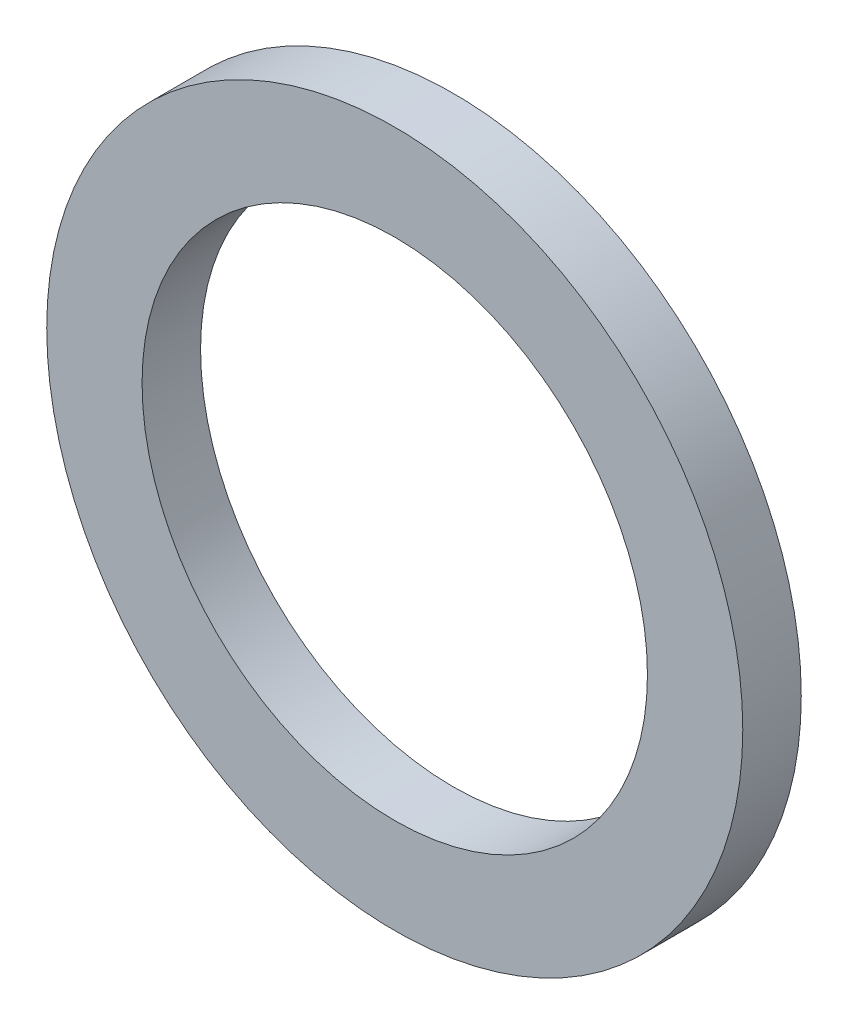
ISO-10303-21;
HEADER;
FILE_DESCRIPTION(('STEP AP214'),'2;1');
FILE_NAME('part.step','',(''),(''),'','','');
FILE_SCHEMA(('AUTOMOTIVE_DESIGN { 1 0 10303 214 1 1 1 1 }'));
ENDSEC;
DATA;
#1=APPLICATION_CONTEXT('core data for automotive mechanical design processes');
#2=APPLICATION_PROTOCOL_DEFINITION('international standard','automotive_design',2000,#1);
#3=PRODUCT_CONTEXT('',#1,'mechanical');
#4=PRODUCT('Part','Part','',(#3));
#5=PRODUCT_RELATED_PRODUCT_CATEGORY('part','',(#4));
#6=PRODUCT_DEFINITION_FORMATION('','',#4);
#7=PRODUCT_DEFINITION_CONTEXT('part definition',#1,'design');
#8=PRODUCT_DEFINITION('design','',#6,#7);
#9=PRODUCT_DEFINITION_SHAPE('','',#8);
#10=(LENGTH_UNIT() NAMED_UNIT(*) SI_UNIT(.MILLI.,.METRE.));
#11=(NAMED_UNIT(*) PLANE_ANGLE_UNIT() SI_UNIT($,.RADIAN.));
#12=(NAMED_UNIT(*) SI_UNIT($,.STERADIAN.) SOLID_ANGLE_UNIT());
#13=UNCERTAINTY_MEASURE_WITH_UNIT(LENGTH_MEASURE(1.E-05),#10,'distance_accuracy_value','');
#14=(GEOMETRIC_REPRESENTATION_CONTEXT(3) GLOBAL_UNCERTAINTY_ASSIGNED_CONTEXT((#13)) GLOBAL_UNIT_ASSIGNED_CONTEXT((#10,
#11,#12)) REPRESENTATION_CONTEXT('',''));
#15=CARTESIAN_POINT('',(0.,0.,0.));
#16=DIRECTION('',(0.,0.,1.));
#17=DIRECTION('',(1.,0.,0.));
#18=AXIS2_PLACEMENT_3D('',#15,#16,#17);
#19=CARTESIAN_POINT('',(0.,0.,2.));
#20=DIRECTION('',(0.,0.,1.));
#21=DIRECTION('',(1.,0.,0.));
#22=AXIS2_PLACEMENT_3D('',#19,#20,#21);
#23=PLANE('',#22);
#24=CARTESIAN_POINT('',(0.,0.,2.));
#25=DIRECTION('',(0.,0.,1.));
#26=DIRECTION('',(1.,0.,0.));
#27=AXIS2_PLACEMENT_3D('',#24,#25,#26);
#28=CIRCLE('',#27,11.9);
#29=CARTESIAN_POINT('',(11.9,0.,2.));
#30=VERTEX_POINT('',#29);
#31=EDGE_CURVE('E10',#30,#30,#28,.T.);
#32=ORIENTED_EDGE('',*,*,#31,.T.);
#33=EDGE_LOOP('',(#32));
#34=FACE_BOUND('',#33,.T.);
#35=CARTESIAN_POINT('',(0.,0.,2.));
#36=DIRECTION('',(0.,0.,1.));
#37=DIRECTION('',(1.,0.,0.));
#38=AXIS2_PLACEMENT_3D('',#35,#36,#37);
#39=CIRCLE('',#38,8.64);
#40=CARTESIAN_POINT('',(8.64,0.,2.));
#41=VERTEX_POINT('',#40);
#42=EDGE_CURVE('E45',#41,#41,#39,.T.);
#43=ORIENTED_EDGE('',*,*,#42,.F.);
#44=EDGE_LOOP('',(#43));
#45=FACE_BOUND('',#44,.T.);
#46=ADVANCED_FACE('F34',(#34,#45),#23,.T.);
#47=CARTESIAN_POINT('',(0.,0.,0.));
#48=DIRECTION('',(0.,0.,1.));
#49=DIRECTION('',(1.,0.,0.));
#50=AXIS2_PLACEMENT_3D('',#47,#48,#49);
#51=PLANE('',#50);
#52=CARTESIAN_POINT('',(0.,0.,0.));
#53=DIRECTION('',(0.,0.,1.));
#54=DIRECTION('',(1.,0.,0.));
#55=AXIS2_PLACEMENT_3D('',#52,#53,#54);
#56=CIRCLE('',#55,11.9);
#57=CARTESIAN_POINT('',(11.9,0.,0.));
#58=VERTEX_POINT('',#57);
#59=EDGE_CURVE('E38',#58,#58,#56,.T.);
#60=ORIENTED_EDGE('',*,*,#59,.F.);
#61=EDGE_LOOP('',(#60));
#62=FACE_BOUND('',#61,.T.);
#63=CARTESIAN_POINT('',(0.,0.,0.));
#64=DIRECTION('',(0.,0.,1.));
#65=DIRECTION('',(1.,0.,0.));
#66=AXIS2_PLACEMENT_3D('',#63,#64,#65);
#67=CIRCLE('',#66,8.64);
#68=CARTESIAN_POINT('',(8.64,0.,0.));
#69=VERTEX_POINT('',#68);
#70=EDGE_CURVE('E47',#69,#69,#67,.T.);
#71=ORIENTED_EDGE('',*,*,#70,.T.);
#72=EDGE_LOOP('',(#71));
#73=FACE_BOUND('',#72,.T.);
#74=ADVANCED_FACE('F57',(#62,#73),#51,.F.);
#75=CARTESIAN_POINT('',(0.,0.,2.));
#76=DIRECTION('',(0.,0.,-1.));
#77=DIRECTION('',(-1.,0.,0.));
#78=AXIS2_PLACEMENT_3D('',#75,#76,#77);
#79=CYLINDRICAL_SURFACE('',#78,11.9);
#80=ORIENTED_EDGE('',*,*,#31,.F.);
#81=EDGE_LOOP('',(#80));
#82=FACE_BOUND('',#81,.T.);
#83=ORIENTED_EDGE('',*,*,#59,.T.);
#84=EDGE_LOOP('',(#83));
#85=FACE_BOUND('',#84,.T.);
#86=ADVANCED_FACE('F36',(#82,#85),#79,.T.);
#87=CARTESIAN_POINT('',(0.,0.,2.));
#88=DIRECTION('',(0.,0.,-1.));
#89=DIRECTION('',(-1.,0.,0.));
#90=AXIS2_PLACEMENT_3D('',#87,#88,#89);
#91=CYLINDRICAL_SURFACE('',#90,8.64);
#92=ORIENTED_EDGE('',*,*,#42,.T.);
#93=EDGE_LOOP('',(#92));
#94=FACE_BOUND('',#93,.T.);
#95=ORIENTED_EDGE('',*,*,#70,.F.);
#96=EDGE_LOOP('',(#95));
#97=FACE_BOUND('',#96,.T.);
#98=ADVANCED_FACE('F53',(#94,#97),#91,.F.);
#99=CLOSED_SHELL('',(#46,#74,#86,#98));
#100=MANIFOLD_SOLID_BREP('B2',#99);
#101=ADVANCED_BREP_SHAPE_REPRESENTATION('',(#18,#100),#14);
#102=SHAPE_DEFINITION_REPRESENTATION(#9,#101);
ENDSEC;
END-ISO-10303-21;
